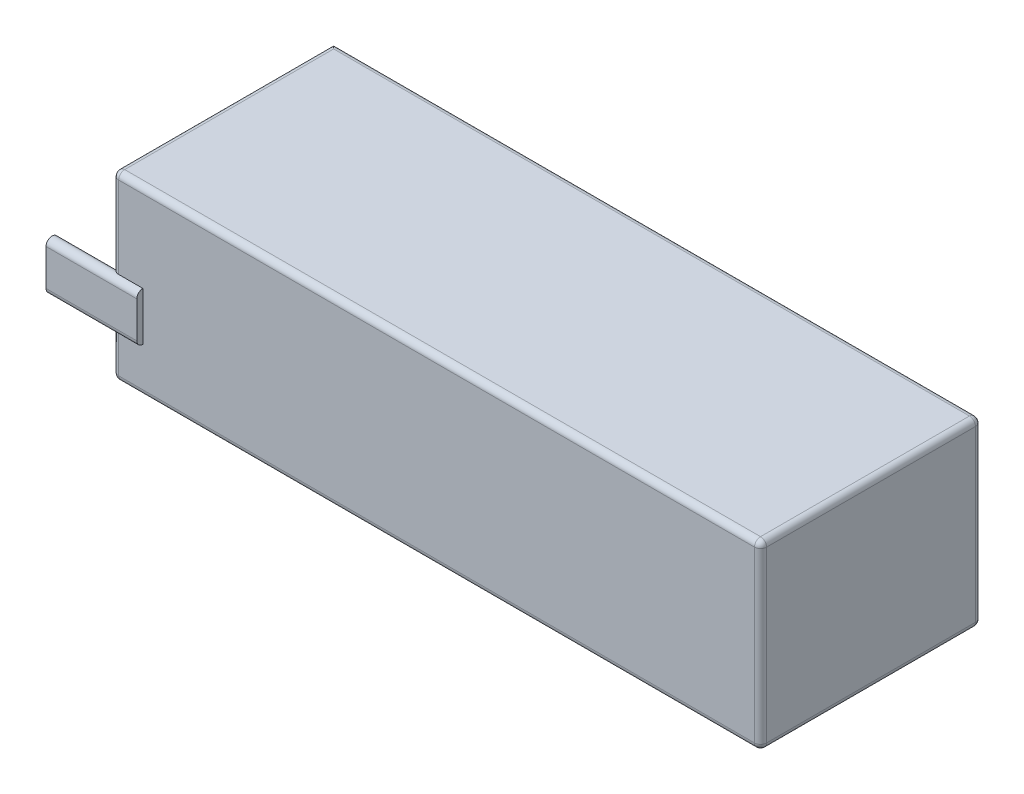
ISO-10303-21;
HEADER;
FILE_DESCRIPTION(('STEP AP214'),'2;1');
FILE_NAME('part.step','',(''),(''),'','','');
FILE_SCHEMA(('AUTOMOTIVE_DESIGN { 1 0 10303 214 1 1 1 1 }'));
ENDSEC;
DATA;
#1=APPLICATION_CONTEXT('core data for automotive mechanical design processes');
#2=APPLICATION_PROTOCOL_DEFINITION('international standard','automotive_design',2000,#1);
#3=PRODUCT_CONTEXT('',#1,'mechanical');
#4=PRODUCT('Part','Part','',(#3));
#5=PRODUCT_RELATED_PRODUCT_CATEGORY('part','',(#4));
#6=PRODUCT_DEFINITION_FORMATION('','',#4);
#7=PRODUCT_DEFINITION_CONTEXT('part definition',#1,'design');
#8=PRODUCT_DEFINITION('design','',#6,#7);
#9=PRODUCT_DEFINITION_SHAPE('','',#8);
#10=(LENGTH_UNIT() NAMED_UNIT(*) SI_UNIT(.MILLI.,.METRE.));
#11=(NAMED_UNIT(*) PLANE_ANGLE_UNIT() SI_UNIT($,.RADIAN.));
#12=(NAMED_UNIT(*) SI_UNIT($,.STERADIAN.) SOLID_ANGLE_UNIT());
#13=UNCERTAINTY_MEASURE_WITH_UNIT(LENGTH_MEASURE(1.E-05),#10,'distance_accuracy_value','');
#14=(GEOMETRIC_REPRESENTATION_CONTEXT(3) GLOBAL_UNCERTAINTY_ASSIGNED_CONTEXT((#13)) GLOBAL_UNIT_ASSIGNED_CONTEXT((#10,
#11,#12)) REPRESENTATION_CONTEXT('',''));
#15=CARTESIAN_POINT('',(0.,0.,0.));
#16=DIRECTION('',(0.,0.,1.));
#17=DIRECTION('',(1.,0.,0.));
#18=AXIS2_PLACEMENT_3D('',#15,#16,#17);
#19=CARTESIAN_POINT('',(-53.5,30.,-18.25));
#20=DIRECTION('',(0.,0.,1.));
#21=DIRECTION('',(1.,0.,0.));
#22=AXIS2_PLACEMENT_3D('',#19,#20,#21);
#23=PLANE('',#22);
#24=DIRECTION('',(0.,-1.,0.));
#25=VECTOR('',#24,1.);
#26=CARTESIAN_POINT('',(52.5,30.,-18.25));
#27=LINE('',#26,#25);
#28=CARTESIAN_POINT('',(52.5,29.,-18.25));
#29=VERTEX_POINT('',#28);
#30=CARTESIAN_POINT('',(52.5,1.,-18.25));
#31=VERTEX_POINT('',#30);
#32=EDGE_CURVE('E294',#29,#31,#27,.T.);
#33=ORIENTED_EDGE('',*,*,#32,.T.);
#34=DIRECTION('',(-1.,0.,0.));
#35=VECTOR('',#34,1.);
#36=CARTESIAN_POINT('',(-53.5,1.,-18.25));
#37=LINE('',#36,#35);
#38=CARTESIAN_POINT('',(-53.5,1.,-18.25));
#39=VERTEX_POINT('',#38);
#40=EDGE_CURVE('E298',#31,#39,#37,.T.);
#41=ORIENTED_EDGE('',*,*,#40,.T.);
#42=DIRECTION('',(0.,-1.,0.));
#43=VECTOR('',#42,1.);
#44=CARTESIAN_POINT('',(-53.5,30.,-18.25));
#45=LINE('',#44,#43);
#46=CARTESIAN_POINT('',(-53.5,9.5,-18.25));
#47=VERTEX_POINT('',#46);
#48=EDGE_CURVE('E252',#47,#39,#45,.T.);
#49=ORIENTED_EDGE('',*,*,#48,.F.);
#50=DIRECTION('',(-1.,0.,0.));
#51=VECTOR('',#50,1.);
#52=CARTESIAN_POINT('',(-48.5,9.5,-18.25));
#53=LINE('',#52,#51);
#54=CARTESIAN_POINT('',(-48.5,9.5,-18.25));
#55=VERTEX_POINT('',#54);
#56=EDGE_CURVE('E259',#55,#47,#53,.T.);
#57=ORIENTED_EDGE('',*,*,#56,.F.);
#58=DIRECTION('',(0.,1.,0.));
#59=VECTOR('',#58,1.);
#60=CARTESIAN_POINT('',(-48.5,9.5,-18.25));
#61=LINE('',#60,#59);
#62=CARTESIAN_POINT('',(-48.5,13.5,-18.25));
#63=VERTEX_POINT('',#62);
#64=EDGE_CURVE('E241',#55,#63,#61,.T.);
#65=ORIENTED_EDGE('',*,*,#64,.T.);
#66=DIRECTION('',(-1.,0.,0.));
#67=VECTOR('',#66,1.);
#68=CARTESIAN_POINT('',(-48.5,13.5,-18.25));
#69=LINE('',#68,#67);
#70=CARTESIAN_POINT('',(-53.5,13.5,-18.25));
#71=VERTEX_POINT('',#70);
#72=EDGE_CURVE('E255',#63,#71,#69,.T.);
#73=ORIENTED_EDGE('',*,*,#72,.T.);
#74=CARTESIAN_POINT('',(-53.5,29.,-18.25));
#75=VERTEX_POINT('',#74);
#76=EDGE_CURVE('E262',#75,#71,#45,.T.);
#77=ORIENTED_EDGE('',*,*,#76,.F.);
#78=DIRECTION('',(-1.,0.,0.));
#79=VECTOR('',#78,1.);
#80=CARTESIAN_POINT('',(53.5,29.,-18.25));
#81=LINE('',#80,#79);
#82=EDGE_CURVE('E296',#75,#29,#81,.F.);
#83=ORIENTED_EDGE('',*,*,#82,.T.);
#84=EDGE_LOOP('',(#33,#41,#49,#57,#65,#73,#77,#83));
#85=FACE_BOUND('',#84,.T.);
#86=ADVANCED_FACE('F37',(#85),#23,.F.);
#87=CARTESIAN_POINT('',(-53.5,30.,-18.25));
#88=DIRECTION('',(1.,0.,0.));
#89=DIRECTION('',(0.,0.,-1.));
#90=AXIS2_PLACEMENT_3D('',#87,#88,#89);
#91=PLANE('',#90);
#92=ORIENTED_EDGE('',*,*,#48,.T.);
#93=DIRECTION('',(0.,0.,1.));
#94=VECTOR('',#93,1.);
#95=CARTESIAN_POINT('',(-53.5,1.,-18.25));
#96=LINE('',#95,#94);
#97=CARTESIAN_POINT('',(-53.5,1.,17.25));
#98=VERTEX_POINT('',#97);
#99=EDGE_CURVE('E306',#39,#98,#96,.T.);
#100=ORIENTED_EDGE('',*,*,#99,.T.);
#101=DIRECTION('',(0.,-1.,0.));
#102=VECTOR('',#101,1.);
#103=CARTESIAN_POINT('',(-53.5,30.,17.25));
#104=LINE('',#103,#102);
#105=CARTESIAN_POINT('',(-53.5,8.5,17.25));
#106=VERTEX_POINT('',#105);
#107=EDGE_CURVE('E304',#98,#106,#104,.F.);
#108=ORIENTED_EDGE('',*,*,#107,.T.);
#109=DIRECTION('',(0.,1.,0.));
#110=VECTOR('',#109,1.);
#111=CARTESIAN_POINT('',(-53.5,30.,17.25));
#112=LINE('',#111,#110);
#113=CARTESIAN_POINT('',(-53.5,14.5,17.25));
#114=VERTEX_POINT('',#113);
#115=EDGE_CURVE('E271',#106,#114,#112,.T.);
#116=ORIENTED_EDGE('',*,*,#115,.T.);
#117=DIRECTION('',(0.,-1.,0.));
#118=VECTOR('',#117,1.);
#119=CARTESIAN_POINT('',(-53.5,30.,17.25));
#120=LINE('',#119,#118);
#121=CARTESIAN_POINT('',(-53.5,29.,17.25));
#122=VERTEX_POINT('',#121);
#123=EDGE_CURVE('E300',#114,#122,#120,.F.);
#124=ORIENTED_EDGE('',*,*,#123,.T.);
#125=DIRECTION('',(0.,0.,1.));
#126=VECTOR('',#125,1.);
#127=CARTESIAN_POINT('',(-53.5,29.,-18.25));
#128=LINE('',#127,#126);
#129=EDGE_CURVE('E302',#122,#75,#128,.F.);
#130=ORIENTED_EDGE('',*,*,#129,.T.);
#131=ORIENTED_EDGE('',*,*,#76,.T.);
#132=EDGE_CURVE('E264',#71,#47,#45,.T.);
#133=ORIENTED_EDGE('',*,*,#132,.T.);
#134=EDGE_LOOP('',(#92,#100,#108,#116,#124,#130,#131,#133));
#135=FACE_BOUND('',#134,.T.);
#136=ADVANCED_FACE('F393',(#135),#91,.F.);
#137=CARTESIAN_POINT('',(-53.5,30.,18.25));
#138=DIRECTION('',(0.,0.,-1.));
#139=DIRECTION('',(-1.,0.,0.));
#140=AXIS2_PLACEMENT_3D('',#137,#138,#139);
#141=PLANE('',#140);
#142=DIRECTION('',(-1.,0.,0.));
#143=VECTOR('',#142,1.);
#144=CARTESIAN_POINT('',(-48.5,7.5,18.25));
#145=LINE('',#144,#143);
#146=CARTESIAN_POINT('',(-48.5,7.5,18.25));
#147=VERTEX_POINT('',#146);
#148=CARTESIAN_POINT('',(-52.5,7.5,18.25));
#149=VERTEX_POINT('',#148);
#150=EDGE_CURVE('E268',#147,#149,#145,.T.);
#151=ORIENTED_EDGE('',*,*,#150,.T.);
#152=DIRECTION('',(0.,-1.,0.));
#153=VECTOR('',#152,1.);
#154=CARTESIAN_POINT('',(-52.5,30.,18.25));
#155=LINE('',#154,#153);
#156=CARTESIAN_POINT('',(-52.5,1.,18.25));
#157=VERTEX_POINT('',#156);
#158=EDGE_CURVE('E283',#149,#157,#155,.T.);
#159=ORIENTED_EDGE('',*,*,#158,.T.);
#160=DIRECTION('',(1.,0.,0.));
#161=VECTOR('',#160,1.);
#162=CARTESIAN_POINT('',(-53.5,1.,18.25));
#163=LINE('',#162,#161);
#164=CARTESIAN_POINT('',(52.5,1.,18.25));
#165=VERTEX_POINT('',#164);
#166=EDGE_CURVE('E280',#157,#165,#163,.T.);
#167=ORIENTED_EDGE('',*,*,#166,.T.);
#168=DIRECTION('',(0.,-1.,0.));
#169=VECTOR('',#168,1.);
#170=CARTESIAN_POINT('',(52.5,30.,18.25));
#171=LINE('',#170,#169);
#172=CARTESIAN_POINT('',(52.5,29.,18.25));
#173=VERTEX_POINT('',#172);
#174=EDGE_CURVE('E278',#165,#173,#171,.F.);
#175=ORIENTED_EDGE('',*,*,#174,.T.);
#176=DIRECTION('',(1.,0.,0.));
#177=VECTOR('',#176,1.);
#178=CARTESIAN_POINT('',(-53.5,29.,18.25));
#179=LINE('',#178,#177);
#180=CARTESIAN_POINT('',(-52.5,29.,18.25));
#181=VERTEX_POINT('',#180);
#182=EDGE_CURVE('E276',#173,#181,#179,.F.);
#183=ORIENTED_EDGE('',*,*,#182,.T.);
#184=DIRECTION('',(0.,-1.,0.));
#185=VECTOR('',#184,1.);
#186=CARTESIAN_POINT('',(-52.5,30.,18.25));
#187=LINE('',#186,#185);
#188=CARTESIAN_POINT('',(-52.5,15.5,18.25));
#189=VERTEX_POINT('',#188);
#190=EDGE_CURVE('E274',#181,#189,#187,.T.);
#191=ORIENTED_EDGE('',*,*,#190,.T.);
#192=DIRECTION('',(-1.,0.,0.));
#193=VECTOR('',#192,1.);
#194=CARTESIAN_POINT('',(-48.5,15.5,18.25));
#195=LINE('',#194,#193);
#196=CARTESIAN_POINT('',(-48.5,15.5,18.25));
#197=VERTEX_POINT('',#196);
#198=EDGE_CURVE('E266',#189,#197,#195,.F.);
#199=ORIENTED_EDGE('',*,*,#198,.T.);
#200=DIRECTION('',(0.,1.,0.));
#201=VECTOR('',#200,1.);
#202=CARTESIAN_POINT('',(-48.5,30.,18.25));
#203=LINE('',#202,#201);
#204=EDGE_CURVE('E208',#147,#197,#203,.T.);
#205=ORIENTED_EDGE('',*,*,#204,.F.);
#206=EDGE_LOOP('',(#151,#159,#167,#175,#183,#191,#199,#205));
#207=FACE_BOUND('',#206,.T.);
#208=ADVANCED_FACE('F397',(#207),#141,.F.);
#209=CARTESIAN_POINT('',(53.5,30.,-18.25));
#210=DIRECTION('',(-1.,0.,0.));
#211=DIRECTION('',(0.,0.,1.));
#212=AXIS2_PLACEMENT_3D('',#209,#210,#211);
#213=PLANE('',#212);
#214=DIRECTION('',(0.,0.,-1.));
#215=VECTOR('',#214,1.);
#216=CARTESIAN_POINT('',(53.5,29.,18.25));
#217=LINE('',#216,#215);
#218=CARTESIAN_POINT('',(53.5,29.,-17.25));
#219=VERTEX_POINT('',#218);
#220=CARTESIAN_POINT('',(53.5,29.,17.25));
#221=VERTEX_POINT('',#220);
#222=EDGE_CURVE('E55',#219,#221,#217,.F.);
#223=ORIENTED_EDGE('',*,*,#222,.T.);
#224=DIRECTION('',(0.,-1.,0.));
#225=VECTOR('',#224,1.);
#226=CARTESIAN_POINT('',(53.5,30.,17.25));
#227=LINE('',#226,#225);
#228=CARTESIAN_POINT('',(53.5,1.,17.25));
#229=VERTEX_POINT('',#228);
#230=EDGE_CURVE('E321',#221,#229,#227,.T.);
#231=ORIENTED_EDGE('',*,*,#230,.T.);
#232=DIRECTION('',(0.,0.,-1.));
#233=VECTOR('',#232,1.);
#234=CARTESIAN_POINT('',(53.5,1.,-18.25));
#235=LINE('',#234,#233);
#236=CARTESIAN_POINT('',(53.5,1.,-17.25));
#237=VERTEX_POINT('',#236);
#238=EDGE_CURVE('E317',#229,#237,#235,.T.);
#239=ORIENTED_EDGE('',*,*,#238,.T.);
#240=DIRECTION('',(0.,-1.,0.));
#241=VECTOR('',#240,1.);
#242=CARTESIAN_POINT('',(53.5,30.,-17.25));
#243=LINE('',#242,#241);
#244=EDGE_CURVE('E60',#237,#219,#243,.F.);
#245=ORIENTED_EDGE('',*,*,#244,.T.);
#246=EDGE_LOOP('',(#223,#231,#239,#245));
#247=FACE_BOUND('',#246,.T.);
#248=ADVANCED_FACE('F386',(#247),#213,.F.);
#249=CARTESIAN_POINT('',(0.,30.,0.));
#250=DIRECTION('',(0.,1.,0.));
#251=DIRECTION('',(0.,0.,1.));
#252=AXIS2_PLACEMENT_3D('',#249,#250,#251);
#253=PLANE('',#252);
#254=DIRECTION('',(-1.,0.,0.));
#255=VECTOR('',#254,1.);
#256=CARTESIAN_POINT('',(-53.5,30.,-17.25));
#257=LINE('',#256,#255);
#258=CARTESIAN_POINT('',(52.5,30.,-17.25));
#259=VERTEX_POINT('',#258);
#260=CARTESIAN_POINT('',(-52.5,30.,-17.25));
#261=VERTEX_POINT('',#260);
#262=EDGE_CURVE('E312',#259,#261,#257,.T.);
#263=ORIENTED_EDGE('',*,*,#262,.T.);
#264=DIRECTION('',(0.,0.,1.));
#265=VECTOR('',#264,1.);
#266=CARTESIAN_POINT('',(-52.5,30.,18.25));
#267=LINE('',#266,#265);
#268=CARTESIAN_POINT('',(-52.5,30.,17.25));
#269=VERTEX_POINT('',#268);
#270=EDGE_CURVE('E315',#261,#269,#267,.T.);
#271=ORIENTED_EDGE('',*,*,#270,.T.);
#272=DIRECTION('',(1.,0.,0.));
#273=VECTOR('',#272,1.);
#274=CARTESIAN_POINT('',(53.5,30.,17.25));
#275=LINE('',#274,#273);
#276=CARTESIAN_POINT('',(52.5,30.,17.25));
#277=VERTEX_POINT('',#276);
#278=EDGE_CURVE('E310',#269,#277,#275,.T.);
#279=ORIENTED_EDGE('',*,*,#278,.T.);
#280=DIRECTION('',(0.,0.,-1.));
#281=VECTOR('',#280,1.);
#282=CARTESIAN_POINT('',(52.5,30.,-18.25));
#283=LINE('',#282,#281);
#284=EDGE_CURVE('E308',#277,#259,#283,.T.);
#285=ORIENTED_EDGE('',*,*,#284,.T.);
#286=EDGE_LOOP('',(#263,#271,#279,#285));
#287=FACE_BOUND('',#286,.T.);
#288=ADVANCED_FACE('F383',(#287),#253,.T.);
#289=CARTESIAN_POINT('',(0.,0.,0.));
#290=DIRECTION('',(0.,1.,0.));
#291=DIRECTION('',(0.,0.,1.));
#292=AXIS2_PLACEMENT_3D('',#289,#290,#291);
#293=PLANE('',#292);
#294=DIRECTION('',(1.,0.,0.));
#295=VECTOR('',#294,1.);
#296=CARTESIAN_POINT('',(0.,0.,17.25));
#297=LINE('',#296,#295);
#298=CARTESIAN_POINT('',(52.5,0.,17.25));
#299=VERTEX_POINT('',#298);
#300=CARTESIAN_POINT('',(-52.5,0.,17.25));
#301=VERTEX_POINT('',#300);
#302=EDGE_CURVE('E289',#299,#301,#297,.F.);
#303=ORIENTED_EDGE('',*,*,#302,.T.);
#304=DIRECTION('',(0.,0.,1.));
#305=VECTOR('',#304,1.);
#306=CARTESIAN_POINT('',(-52.5,0.,0.));
#307=LINE('',#306,#305);
#308=CARTESIAN_POINT('',(-52.5,0.,-17.25));
#309=VERTEX_POINT('',#308);
#310=EDGE_CURVE('E292',#301,#309,#307,.F.);
#311=ORIENTED_EDGE('',*,*,#310,.T.);
#312=DIRECTION('',(-1.,0.,0.));
#313=VECTOR('',#312,1.);
#314=CARTESIAN_POINT('',(0.,0.,-17.25));
#315=LINE('',#314,#313);
#316=CARTESIAN_POINT('',(52.5,0.,-17.25));
#317=VERTEX_POINT('',#316);
#318=EDGE_CURVE('E287',#309,#317,#315,.F.);
#319=ORIENTED_EDGE('',*,*,#318,.T.);
#320=DIRECTION('',(0.,0.,-1.));
#321=VECTOR('',#320,1.);
#322=CARTESIAN_POINT('',(52.5,0.,0.));
#323=LINE('',#322,#321);
#324=EDGE_CURVE('E285',#317,#299,#323,.F.);
#325=ORIENTED_EDGE('',*,*,#324,.T.);
#326=EDGE_LOOP('',(#303,#311,#319,#325));
#327=FACE_BOUND('',#326,.T.);
#328=ADVANCED_FACE('F378',(#327),#293,.F.);
#329=CARTESIAN_POINT('',(-48.5,9.5,-18.25));
#330=DIRECTION('',(0.,0.,1.));
#331=DIRECTION('',(1.,0.,0.));
#332=AXIS2_PLACEMENT_3D('',#329,#330,#331);
#333=PLANE('',#332);
#334=ORIENTED_EDGE('',*,*,#132,.F.);
#335=CARTESIAN_POINT('',(-63.5,13.5,-18.25));
#336=VERTEX_POINT('',#335);
#337=EDGE_CURVE('E258',#71,#336,#69,.T.);
#338=ORIENTED_EDGE('',*,*,#337,.T.);
#339=DIRECTION('',(0.,1.,0.));
#340=VECTOR('',#339,1.);
#341=CARTESIAN_POINT('',(-63.5,9.5,-18.25));
#342=LINE('',#341,#340);
#343=CARTESIAN_POINT('',(-63.5,9.5,-18.25));
#344=VERTEX_POINT('',#343);
#345=EDGE_CURVE('E229',#344,#336,#342,.T.);
#346=ORIENTED_EDGE('',*,*,#345,.F.);
#347=EDGE_CURVE('E249',#47,#344,#53,.T.);
#348=ORIENTED_EDGE('',*,*,#347,.F.);
#349=EDGE_LOOP('',(#334,#338,#346,#348));
#350=FACE_BOUND('',#349,.T.);
#351=ADVANCED_FACE('F375',(#350),#333,.T.);
#352=CARTESIAN_POINT('',(-48.5,9.5,-19.75));
#353=DIRECTION('',(-1.,0.,0.));
#354=DIRECTION('',(0.,0.,1.));
#355=AXIS2_PLACEMENT_3D('',#352,#353,#354);
#356=CYLINDRICAL_SURFACE('',#355,1.5);
#357=ORIENTED_EDGE('',*,*,#56,.T.);
#358=ORIENTED_EDGE('',*,*,#347,.T.);
#359=CARTESIAN_POINT('',(-63.5,9.5,-19.75));
#360=DIRECTION('',(-1.,0.,0.));
#361=DIRECTION('',(0.,0.,1.));
#362=AXIS2_PLACEMENT_3D('',#359,#360,#361);
#363=CIRCLE('',#362,1.5);
#364=CARTESIAN_POINT('',(-63.5,9.5,-21.25));
#365=VERTEX_POINT('',#364);
#366=EDGE_CURVE('E226',#365,#344,#363,.T.);
#367=ORIENTED_EDGE('',*,*,#366,.F.);
#368=DIRECTION('',(-1.,0.,0.));
#369=VECTOR('',#368,1.);
#370=CARTESIAN_POINT('',(-48.5,9.5,-21.25));
#371=LINE('',#370,#369);
#372=CARTESIAN_POINT('',(-48.5,9.5,-21.25));
#373=VERTEX_POINT('',#372);
#374=EDGE_CURVE('E250',#373,#365,#371,.T.);
#375=ORIENTED_EDGE('',*,*,#374,.F.);
#376=CARTESIAN_POINT('',(-48.5,9.5,-19.75));
#377=DIRECTION('',(-1.,0.,0.));
#378=DIRECTION('',(0.,0.,1.));
#379=AXIS2_PLACEMENT_3D('',#376,#377,#378);
#380=CIRCLE('',#379,1.5);
#381=EDGE_CURVE('E238',#373,#55,#380,.T.);
#382=ORIENTED_EDGE('',*,*,#381,.T.);
#383=EDGE_LOOP('',(#357,#358,#367,#375,#382));
#384=FACE_BOUND('',#383,.T.);
#385=ADVANCED_FACE('F370',(#384),#356,.T.);
#386=CARTESIAN_POINT('',(-48.5,9.5,-21.25));
#387=DIRECTION('',(0.,0.,-1.));
#388=DIRECTION('',(-1.,0.,0.));
#389=AXIS2_PLACEMENT_3D('',#386,#387,#388);
#390=PLANE('',#389);
#391=ORIENTED_EDGE('',*,*,#374,.T.);
#392=DIRECTION('',(0.,-1.,0.));
#393=VECTOR('',#392,1.);
#394=CARTESIAN_POINT('',(-63.5,9.5,-21.25));
#395=LINE('',#394,#393);
#396=CARTESIAN_POINT('',(-63.5,13.5,-21.25));
#397=VERTEX_POINT('',#396);
#398=EDGE_CURVE('E235',#397,#365,#395,.T.);
#399=ORIENTED_EDGE('',*,*,#398,.F.);
#400=DIRECTION('',(-1.,0.,0.));
#401=VECTOR('',#400,1.);
#402=CARTESIAN_POINT('',(-48.5,13.5,-21.25));
#403=LINE('',#402,#401);
#404=CARTESIAN_POINT('',(-48.5,13.5,-21.25));
#405=VERTEX_POINT('',#404);
#406=EDGE_CURVE('E253',#405,#397,#403,.T.);
#407=ORIENTED_EDGE('',*,*,#406,.F.);
#408=DIRECTION('',(0.,-1.,0.));
#409=VECTOR('',#408,1.);
#410=CARTESIAN_POINT('',(-48.5,9.5,-21.25));
#411=LINE('',#410,#409);
#412=EDGE_CURVE('E246',#405,#373,#411,.T.);
#413=ORIENTED_EDGE('',*,*,#412,.T.);
#414=EDGE_LOOP('',(#391,#399,#407,#413));
#415=FACE_BOUND('',#414,.T.);
#416=ADVANCED_FACE('F367',(#415),#390,.T.);
#417=CARTESIAN_POINT('',(-48.5,13.5,-19.75));
#418=DIRECTION('',(-1.,0.,0.));
#419=DIRECTION('',(0.,0.,1.));
#420=AXIS2_PLACEMENT_3D('',#417,#418,#419);
#421=CYLINDRICAL_SURFACE('',#420,1.5);
#422=ORIENTED_EDGE('',*,*,#406,.T.);
#423=CARTESIAN_POINT('',(-63.5,13.5,-19.75));
#424=DIRECTION('',(-1.,0.,0.));
#425=DIRECTION('',(0.,0.,1.));
#426=AXIS2_PLACEMENT_3D('',#423,#424,#425);
#427=CIRCLE('',#426,1.5);
#428=EDGE_CURVE('E232',#336,#397,#427,.T.);
#429=ORIENTED_EDGE('',*,*,#428,.F.);
#430=ORIENTED_EDGE('',*,*,#337,.F.);
#431=ORIENTED_EDGE('',*,*,#72,.F.);
#432=CARTESIAN_POINT('',(-48.5,13.5,-19.75));
#433=DIRECTION('',(-1.,0.,0.));
#434=DIRECTION('',(0.,0.,1.));
#435=AXIS2_PLACEMENT_3D('',#432,#433,#434);
#436=CIRCLE('',#435,1.5);
#437=EDGE_CURVE('E243',#63,#405,#436,.T.);
#438=ORIENTED_EDGE('',*,*,#437,.T.);
#439=EDGE_LOOP('',(#422,#429,#430,#431,#438));
#440=FACE_BOUND('',#439,.T.);
#441=ADVANCED_FACE('F365',(#440),#421,.T.);
#442=CARTESIAN_POINT('',(-48.5,9.5,-19.75));
#443=DIRECTION('',(-1.,0.,0.));
#444=DIRECTION('',(0.,0.,1.));
#445=AXIS2_PLACEMENT_3D('',#442,#443,#444);
#446=PLANE('',#445);
#447=ORIENTED_EDGE('',*,*,#381,.F.);
#448=ORIENTED_EDGE('',*,*,#412,.F.);
#449=ORIENTED_EDGE('',*,*,#437,.F.);
#450=ORIENTED_EDGE('',*,*,#64,.F.);
#451=EDGE_LOOP('',(#447,#448,#449,#450));
#452=FACE_BOUND('',#451,.T.);
#453=ADVANCED_FACE('F361',(#452),#446,.F.);
#454=CARTESIAN_POINT('',(-63.5,9.5,-19.75));
#455=DIRECTION('',(-1.,0.,0.));
#456=DIRECTION('',(0.,0.,1.));
#457=AXIS2_PLACEMENT_3D('',#454,#455,#456);
#458=PLANE('',#457);
#459=ORIENTED_EDGE('',*,*,#366,.T.);
#460=ORIENTED_EDGE('',*,*,#345,.T.);
#461=ORIENTED_EDGE('',*,*,#428,.T.);
#462=ORIENTED_EDGE('',*,*,#398,.T.);
#463=EDGE_LOOP('',(#459,#460,#461,#462));
#464=FACE_BOUND('',#463,.T.);
#465=ADVANCED_FACE('F352',(#464),#458,.T.);
#466=CARTESIAN_POINT('',(-48.5,8.5,17.25));
#467=DIRECTION('',(0.,0.,-1.));
#468=DIRECTION('',(-1.,0.,0.));
#469=AXIS2_PLACEMENT_3D('',#466,#467,#468);
#470=PLANE('',#469);
#471=ORIENTED_EDGE('',*,*,#115,.F.);
#472=DIRECTION('',(-1.,0.,0.));
#473=VECTOR('',#472,1.);
#474=CARTESIAN_POINT('',(-48.5,8.5,17.25));
#475=LINE('',#474,#473);
#476=CARTESIAN_POINT('',(-63.5,8.5,17.25));
#477=VERTEX_POINT('',#476);
#478=EDGE_CURVE('E474',#106,#477,#475,.T.);
#479=ORIENTED_EDGE('',*,*,#478,.T.);
#480=DIRECTION('',(0.,-1.,0.));
#481=VECTOR('',#480,1.);
#482=CARTESIAN_POINT('',(-63.5,8.5,17.25));
#483=LINE('',#482,#481);
#484=CARTESIAN_POINT('',(-63.5,14.5,17.25));
#485=VERTEX_POINT('',#484);
#486=EDGE_CURVE('E214',#485,#477,#483,.T.);
#487=ORIENTED_EDGE('',*,*,#486,.F.);
#488=DIRECTION('',(-1.,0.,0.));
#489=VECTOR('',#488,1.);
#490=CARTESIAN_POINT('',(-48.5,14.5,17.25));
#491=LINE('',#490,#489);
#492=EDGE_CURVE('E200',#114,#485,#491,.T.);
#493=ORIENTED_EDGE('',*,*,#492,.F.);
#494=EDGE_LOOP('',(#471,#479,#487,#493));
#495=FACE_BOUND('',#494,.T.);
#496=ADVANCED_FACE('F343',(#495),#470,.T.);
#497=CARTESIAN_POINT('',(-48.5,8.5,18.25));
#498=DIRECTION('',(-1.,0.,0.));
#499=DIRECTION('',(0.,0.,1.));
#500=AXIS2_PLACEMENT_3D('',#497,#498,#499);
#501=CYLINDRICAL_SURFACE('',#500,1.);
#502=ORIENTED_EDGE('',*,*,#478,.F.);
#503=CARTESIAN_POINT('',(-53.5,8.5,17.25));
#504=CARTESIAN_POINT('',(-53.4999915273139,8.4721618072782,17.2499974449256));
#505=CARTESIAN_POINT('',(-53.49999978463,8.44432491694179,17.2511624505639));
#506=CARTESIAN_POINT('',(-53.4999880697923,8.38884512847469,17.255807753806));
#507=CARTESIAN_POINT('',(-53.4999680978103,8.36120222916399,17.2592880373139));
#508=CARTESIAN_POINT('',(-53.499838122104,8.30625318801878,17.2685522068392));
#509=CARTESIAN_POINT('',(-53.4997279600974,8.27894772396443,17.2743401335675));
#510=CARTESIAN_POINT('',(-53.4992948443434,8.22492462235579,17.2881724855126));
#511=CARTESIAN_POINT('',(-53.4989718933492,8.19820697720056,17.2962168815332));
#512=CARTESIAN_POINT('',(-53.4974536894179,8.1191613993586,17.3236805454581));
#513=CARTESIAN_POINT('',(-53.4957090051225,8.06795071523256,17.3464286131267));
#514=CARTESIAN_POINT('',(-53.4890478897459,7.97023848573536,17.4000264090444));
#515=CARTESIAN_POINT('',(-53.4841343606377,7.92373267675533,17.4308687094247));
#516=CARTESIAN_POINT('',(-53.4693336992212,7.838654900196,17.4980423414366));
#517=CARTESIAN_POINT('',(-53.4596481926507,7.79984410209823,17.5341124218488));
#518=CARTESIAN_POINT('',(-53.4335989981964,7.72940315441028,17.6105697570729));
#519=CARTESIAN_POINT('',(-53.417245590848,7.69776206691236,17.6509502956064));
#520=CARTESIAN_POINT('',(-53.3794734224097,7.64622485409753,17.7275936517136));
#521=CARTESIAN_POINT('',(-53.3590473185644,7.625316220434,17.7636686646856));
#522=CARTESIAN_POINT('',(-53.3122441705969,7.5893643518775,17.8348688895248));
#523=CARTESIAN_POINT('',(-53.2858668676329,7.57432137218339,17.869994060005));
#524=CARTESIAN_POINT('',(-53.2293358302535,7.55015559677196,17.9354434191223));
#525=CARTESIAN_POINT('',(-53.1994890903201,7.5407405067344,17.9659278211332));
#526=CARTESIAN_POINT('',(-53.1356188135375,7.52560891786249,18.023195036806));
#527=CARTESIAN_POINT('',(-53.1015942735558,7.51989330938569,18.0499769581697));
#528=CARTESIAN_POINT('',(-53.0265924301931,7.51071496387938,18.1014506190333));
#529=CARTESIAN_POINT('',(-52.9852603057874,7.50753084904885,18.1256738815927));
#530=CARTESIAN_POINT('',(-52.8994625197932,7.50314024893534,18.1679998708196));
#531=CARTESIAN_POINT('',(-52.854994278958,7.50193541173267,18.1860974869159));
#532=CARTESIAN_POINT('',(-52.7595676332025,7.50040577184265,18.2171453798211));
#533=CARTESIAN_POINT('',(-52.7083933218189,7.50017506579652,18.2294462717386));
#534=CARTESIAN_POINT('',(-52.6307230912508,7.50002667819821,18.2417668949806));
#535=CARTESIAN_POINT('',(-52.6046769026901,7.50001017537287,18.2448519867077));
#536=CARTESIAN_POINT('',(-52.5524243977987,7.49999937163049,18.2489682613339));
#537=CARTESIAN_POINT('',(-52.5262180920361,7.50000506926366,18.2499995783472));
#538=CARTESIAN_POINT('',(-52.5,7.5,18.25));
#539=B_SPLINE_CURVE_WITH_KNOTS('',3,(#503,#504,#505,#506,#507,#508,#509,#510,#511,#512,#513,
#514,#515,#516,#517,#518,#519,#520,#521,#522,#523,#524,#525,#526,#527,#528,#529,#530,#531,#532,
#533,#534,#535,#536,#537,#538),.UNSPECIFIED.,.F.,.F.,(4,2,2,2,2,2,2,2,2,2,2,2,2,2,2,2,2,4),(0.,
0.083487834728174,0.166975161167903,0.250609321497258,0.334242399739242,0.501538275082881,
0.668681160903593,0.829299803909306,0.989671736729568,1.12821123604276,1.26675676216527,
1.39728229603103,1.52783923192528,1.67130468492801,1.81488953652532,1.97206569111011,
2.05068136863726,2.12929191228915),.UNSPECIFIED.);
#540=EDGE_CURVE('E47',#106,#149,#539,.T.);
#541=ORIENTED_EDGE('',*,*,#540,.T.);
#542=ORIENTED_EDGE('',*,*,#150,.F.);
#543=CARTESIAN_POINT('',(-48.5,8.5,18.25));
#544=DIRECTION('',(-1.,0.,0.));
#545=DIRECTION('',(0.,0.,1.));
#546=AXIS2_PLACEMENT_3D('',#543,#544,#545);
#547=CIRCLE('',#546,1.);
#548=CARTESIAN_POINT('',(-48.5,8.5,19.25));
#549=VERTEX_POINT('',#548);
#550=EDGE_CURVE('E212',#147,#549,#547,.T.);
#551=ORIENTED_EDGE('',*,*,#550,.T.);
#552=DIRECTION('',(-1.,0.,0.));
#553=VECTOR('',#552,1.);
#554=CARTESIAN_POINT('',(-48.5,8.5,19.25));
#555=LINE('',#554,#553);
#556=CARTESIAN_POINT('',(-63.5,8.5,19.25));
#557=VERTEX_POINT('',#556);
#558=EDGE_CURVE('E199',#549,#557,#555,.T.);
#559=ORIENTED_EDGE('',*,*,#558,.T.);
#560=CARTESIAN_POINT('',(-63.5,8.5,18.25));
#561=DIRECTION('',(-1.,0.,0.));
#562=DIRECTION('',(0.,0.,1.));
#563=AXIS2_PLACEMENT_3D('',#560,#561,#562);
#564=CIRCLE('',#563,1.);
#565=EDGE_CURVE('E223',#477,#557,#564,.T.);
#566=ORIENTED_EDGE('',*,*,#565,.F.);
#567=EDGE_LOOP('',(#502,#541,#542,#551,#559,#566));
#568=FACE_BOUND('',#567,.T.);
#569=ADVANCED_FACE('F339',(#568),#501,.T.);
#570=CARTESIAN_POINT('',(-48.5,14.5,18.25));
#571=DIRECTION('',(-1.,0.,0.));
#572=DIRECTION('',(0.,0.,1.));
#573=AXIS2_PLACEMENT_3D('',#570,#571,#572);
#574=CYLINDRICAL_SURFACE('',#573,1.);
#575=ORIENTED_EDGE('',*,*,#198,.F.);
#576=CARTESIAN_POINT('',(-52.5,15.5,18.25));
#577=CARTESIAN_POINT('',(-52.5278381927218,15.4999915273139,18.2500025550744));
#578=CARTESIAN_POINT('',(-52.5556750830582,15.49999978463,18.2488375494361));
#579=CARTESIAN_POINT('',(-52.6111548715253,15.4999880697923,18.2441922461939));
#580=CARTESIAN_POINT('',(-52.638797770836,15.4999680978104,18.240711962686));
#581=CARTESIAN_POINT('',(-52.6937468119812,15.499838122104,18.2314477931608));
#582=CARTESIAN_POINT('',(-52.7210522760356,15.4997279600974,18.2256598664325));
#583=CARTESIAN_POINT('',(-52.7750753776442,15.4992948443434,18.2118275144874));
#584=CARTESIAN_POINT('',(-52.8017930227994,15.4989718933492,18.2037831184667));
#585=CARTESIAN_POINT('',(-52.8808386006414,15.4974536894179,18.1763194545419));
#586=CARTESIAN_POINT('',(-52.9320492847674,15.4957090051225,18.1535713868733));
#587=CARTESIAN_POINT('',(-53.0297615142646,15.4890478897459,18.0999735909556));
#588=CARTESIAN_POINT('',(-53.0762673232447,15.4841343606377,18.0691312905752));
#589=CARTESIAN_POINT('',(-53.161345099804,15.4693336992212,18.0019576585634));
#590=CARTESIAN_POINT('',(-53.2001558979018,15.4596481926507,17.9658875781512));
#591=CARTESIAN_POINT('',(-53.2705968455897,15.4335989981964,17.8894302429271));
#592=CARTESIAN_POINT('',(-53.3022379330876,15.417245590848,17.8490497043936));
#593=CARTESIAN_POINT('',(-53.3537751459025,15.3794734224097,17.7724063482864));
#594=CARTESIAN_POINT('',(-53.374683779566,15.3590473185644,17.7363313353144));
#595=CARTESIAN_POINT('',(-53.4106356481225,15.3122441705969,17.6651311104752));
#596=CARTESIAN_POINT('',(-53.4256786278166,15.2858668676329,17.630005939995));
#597=CARTESIAN_POINT('',(-53.449844403228,15.2293358302535,17.5645565808777));
#598=CARTESIAN_POINT('',(-53.4592594932656,15.1994890903201,17.5340721788668));
#599=CARTESIAN_POINT('',(-53.4743910821375,15.1356188135375,17.476804963194));
#600=CARTESIAN_POINT('',(-53.4801066906143,15.1015942735558,17.4500230418303));
#601=CARTESIAN_POINT('',(-53.4892850361206,15.0265924301931,17.3985493809667));
#602=CARTESIAN_POINT('',(-53.4924691509511,14.9852603057874,17.3743261184073));
#603=CARTESIAN_POINT('',(-53.4968597510647,14.8994625197932,17.3320001291804));
#604=CARTESIAN_POINT('',(-53.4980645882673,14.854994278958,17.3139025130841));
#605=CARTESIAN_POINT('',(-53.4995942281573,14.7595676332025,17.2828546201789));
#606=CARTESIAN_POINT('',(-53.4998249342035,14.7083933218189,17.2705537282614));
#607=CARTESIAN_POINT('',(-53.4999733218018,14.6307230912508,17.2582331050194));
#608=CARTESIAN_POINT('',(-53.4999898246271,14.6046769026901,17.2551480132923));
#609=CARTESIAN_POINT('',(-53.5000006283695,14.5524243977987,17.2510317386661));
#610=CARTESIAN_POINT('',(-53.4999949307363,14.5262180920361,17.2500004216528));
#611=CARTESIAN_POINT('',(-53.5,14.5,17.25));
#612=B_SPLINE_CURVE_WITH_KNOTS('',3,(#576,#577,#578,#579,#580,#581,#582,#583,#584,#585,#586,
#587,#588,#589,#590,#591,#592,#593,#594,#595,#596,#597,#598,#599,#600,#601,#602,#603,#604,#605,
#606,#607,#608,#609,#610,#611),.UNSPECIFIED.,.F.,.F.,(4,2,2,2,2,2,2,2,2,2,2,2,2,2,2,2,2,4),(0.,
0.0834878347281705,0.166975161167899,0.250609321497252,0.334242399739242,0.501538275082882,
0.668681160903596,0.829299803909303,0.989671736729569,1.12821123604275,1.26675676216527,
1.39728229603103,1.52783923192528,1.671304684928,1.81488953652532,1.97206569111011,
2.05068136863727,2.12929191228916),.UNSPECIFIED.);
#613=EDGE_CURVE('E11',#189,#114,#612,.T.);
#614=ORIENTED_EDGE('',*,*,#613,.T.);
#615=ORIENTED_EDGE('',*,*,#492,.T.);
#616=CARTESIAN_POINT('',(-63.5,14.5,18.25));
#617=DIRECTION('',(-1.,0.,0.));
#618=DIRECTION('',(0.,0.,1.));
#619=AXIS2_PLACEMENT_3D('',#616,#617,#618);
#620=CIRCLE('',#619,1.);
#621=CARTESIAN_POINT('',(-63.5,14.5,19.25));
#622=VERTEX_POINT('',#621);
#623=EDGE_CURVE('E194',#622,#485,#620,.T.);
#624=ORIENTED_EDGE('',*,*,#623,.F.);
#625=DIRECTION('',(-1.,0.,0.));
#626=VECTOR('',#625,1.);
#627=CARTESIAN_POINT('',(-48.5,14.5,19.25));
#628=LINE('',#627,#626);
#629=CARTESIAN_POINT('',(-48.5,14.5,19.25));
#630=VERTEX_POINT('',#629);
#631=EDGE_CURVE('E188',#630,#622,#628,.T.);
#632=ORIENTED_EDGE('',*,*,#631,.F.);
#633=CARTESIAN_POINT('',(-48.5,14.5,18.25));
#634=DIRECTION('',(-1.,0.,0.));
#635=DIRECTION('',(0.,0.,1.));
#636=AXIS2_PLACEMENT_3D('',#633,#634,#635);
#637=CIRCLE('',#636,1.);
#638=EDGE_CURVE('E192',#630,#197,#637,.T.);
#639=ORIENTED_EDGE('',*,*,#638,.T.);
#640=EDGE_LOOP('',(#575,#614,#615,#624,#632,#639));
#641=FACE_BOUND('',#640,.T.);
#642=ADVANCED_FACE('F191',(#641),#574,.T.);
#643=CARTESIAN_POINT('',(-48.5,8.5,18.25));
#644=DIRECTION('',(-1.,0.,0.));
#645=DIRECTION('',(0.,0.,1.));
#646=AXIS2_PLACEMENT_3D('',#643,#644,#645);
#647=PLANE('',#646);
#648=ORIENTED_EDGE('',*,*,#550,.F.);
#649=ORIENTED_EDGE('',*,*,#204,.T.);
#650=ORIENTED_EDGE('',*,*,#638,.F.);
#651=DIRECTION('',(0.,1.,0.));
#652=VECTOR('',#651,1.);
#653=CARTESIAN_POINT('',(-48.5,8.5,19.25));
#654=LINE('',#653,#652);
#655=EDGE_CURVE('E207',#549,#630,#654,.T.);
#656=ORIENTED_EDGE('',*,*,#655,.F.);
#657=EDGE_LOOP('',(#648,#649,#650,#656));
#658=FACE_BOUND('',#657,.T.);
#659=ADVANCED_FACE('F206',(#658),#647,.F.);
#660=CARTESIAN_POINT('',(-48.5,8.5,19.25));
#661=DIRECTION('',(0.,0.,1.));
#662=DIRECTION('',(1.,0.,0.));
#663=AXIS2_PLACEMENT_3D('',#660,#661,#662);
#664=PLANE('',#663);
#665=ORIENTED_EDGE('',*,*,#631,.T.);
#666=DIRECTION('',(0.,1.,0.));
#667=VECTOR('',#666,1.);
#668=CARTESIAN_POINT('',(-63.5,8.5,19.25));
#669=LINE('',#668,#667);
#670=EDGE_CURVE('E221',#557,#622,#669,.T.);
#671=ORIENTED_EDGE('',*,*,#670,.F.);
#672=ORIENTED_EDGE('',*,*,#558,.F.);
#673=ORIENTED_EDGE('',*,*,#655,.T.);
#674=EDGE_LOOP('',(#665,#671,#672,#673));
#675=FACE_BOUND('',#674,.T.);
#676=ADVANCED_FACE('F211',(#675),#664,.T.);
#677=CARTESIAN_POINT('',(-63.5,8.5,18.25));
#678=DIRECTION('',(-1.,0.,0.));
#679=DIRECTION('',(0.,0.,1.));
#680=AXIS2_PLACEMENT_3D('',#677,#678,#679);
#681=PLANE('',#680);
#682=ORIENTED_EDGE('',*,*,#565,.T.);
#683=ORIENTED_EDGE('',*,*,#670,.T.);
#684=ORIENTED_EDGE('',*,*,#623,.T.);
#685=ORIENTED_EDGE('',*,*,#486,.T.);
#686=EDGE_LOOP('',(#682,#683,#684,#685));
#687=FACE_BOUND('',#686,.T.);
#688=ADVANCED_FACE('F346',(#687),#681,.T.);
#689=CARTESIAN_POINT('',(-52.5,30.,17.25));
#690=DIRECTION('',(0.,-1.,0.));
#691=DIRECTION('',(0.,0.,-1.));
#692=AXIS2_PLACEMENT_3D('',#689,#690,#691);
#693=CYLINDRICAL_SURFACE('',#692,1.);
#694=ORIENTED_EDGE('',*,*,#613,.F.);
#695=ORIENTED_EDGE('',*,*,#190,.F.);
#696=CARTESIAN_POINT('',(-52.5,29.,17.25));
#697=DIRECTION('',(0.,1.,0.));
#698=DIRECTION('',(0.,0.,1.));
#699=AXIS2_PLACEMENT_3D('',#696,#697,#698);
#700=CIRCLE('',#699,1.);
#701=EDGE_CURVE('E469',#122,#181,#700,.T.);
#702=ORIENTED_EDGE('',*,*,#701,.F.);
#703=ORIENTED_EDGE('',*,*,#123,.F.);
#704=EDGE_LOOP('',(#694,#695,#702,#703));
#705=FACE_BOUND('',#704,.T.);
#706=ADVANCED_FACE('F39',(#705),#693,.T.);
#707=CARTESIAN_POINT('',(-52.5,29.,0.));
#708=DIRECTION('',(0.,0.,-1.));
#709=DIRECTION('',(-1.,0.,0.));
#710=AXIS2_PLACEMENT_3D('',#707,#708,#709);
#711=CYLINDRICAL_SURFACE('',#710,1.);
#712=CARTESIAN_POINT('',(-52.5,29.,17.25));
#713=DIRECTION('',(0.,0.,1.));
#714=DIRECTION('',(1.,0.,0.));
#715=AXIS2_PLACEMENT_3D('',#712,#713,#714);
#716=CIRCLE('',#715,1.);
#717=EDGE_CURVE('E467',#269,#122,#716,.T.);
#718=ORIENTED_EDGE('',*,*,#717,.F.);
#719=ORIENTED_EDGE('',*,*,#270,.F.);
#720=CARTESIAN_POINT('',(-52.5,29.,-17.25));
#721=DIRECTION('',(0.707106781186547,0.,-0.707106781186547));
#722=DIRECTION('',(-0.707106781186547,0.,-0.707106781186547));
#723=AXIS2_PLACEMENT_3D('',#720,#721,#722);
#724=ELLIPSE('',#723,1.41421356237309,1.);
#725=EDGE_CURVE('E42',#75,#261,#724,.T.);
#726=ORIENTED_EDGE('',*,*,#725,.F.);
#727=ORIENTED_EDGE('',*,*,#129,.F.);
#728=EDGE_LOOP('',(#718,#719,#726,#727));
#729=FACE_BOUND('',#728,.T.);
#730=ADVANCED_FACE('F497',(#729),#711,.T.);
#731=CARTESIAN_POINT('',(0.,29.,-17.25));
#732=DIRECTION('',(1.,0.,0.));
#733=DIRECTION('',(0.,0.,-1.));
#734=AXIS2_PLACEMENT_3D('',#731,#732,#733);
#735=CYLINDRICAL_SURFACE('',#734,1.);
#736=ORIENTED_EDGE('',*,*,#725,.T.);
#737=ORIENTED_EDGE('',*,*,#262,.F.);
#738=CARTESIAN_POINT('',(52.5,29.,-17.25));
#739=DIRECTION('',(1.,0.,0.));
#740=DIRECTION('',(0.,0.,-1.));
#741=AXIS2_PLACEMENT_3D('',#738,#739,#740);
#742=CIRCLE('',#741,1.);
#743=EDGE_CURVE('E464',#29,#259,#742,.T.);
#744=ORIENTED_EDGE('',*,*,#743,.F.);
#745=ORIENTED_EDGE('',*,*,#82,.F.);
#746=EDGE_LOOP('',(#736,#737,#744,#745));
#747=FACE_BOUND('',#746,.T.);
#748=ADVANCED_FACE('F499',(#747),#735,.T.);
#749=CARTESIAN_POINT('',(-52.5,29.,17.25));
#750=DIRECTION('',(-1.,0.,0.));
#751=DIRECTION('',(0.,0.,1.));
#752=AXIS2_PLACEMENT_3D('',#749,#750,#751);
#753=SPHERICAL_SURFACE('',#752,1.);
#754=ORIENTED_EDGE('',*,*,#717,.T.);
#755=ORIENTED_EDGE('',*,*,#701,.T.);
#756=CARTESIAN_POINT('',(-52.5,29.,17.25));
#757=DIRECTION('',(-1.,0.,0.));
#758=DIRECTION('',(0.,0.,1.));
#759=AXIS2_PLACEMENT_3D('',#756,#757,#758);
#760=CIRCLE('',#759,1.);
#761=EDGE_CURVE('E461',#269,#181,#760,.F.);
#762=ORIENTED_EDGE('',*,*,#761,.F.);
#763=EDGE_LOOP('',(#754,#755,#762));
#764=FACE_BOUND('',#763,.T.);
#765=ADVANCED_FACE('F557',(#764),#753,.T.);
#766=CARTESIAN_POINT('',(52.5,29.,-17.25));
#767=DIRECTION('',(0.,1.,0.));
#768=DIRECTION('',(0.,0.,1.));
#769=AXIS2_PLACEMENT_3D('',#766,#767,#768);
#770=SPHERICAL_SURFACE('',#769,1.);
#771=CARTESIAN_POINT('',(52.5,29.,-17.25));
#772=DIRECTION('',(0.,1.,0.));
#773=DIRECTION('',(0.,0.,1.));
#774=AXIS2_PLACEMENT_3D('',#771,#772,#773);
#775=CIRCLE('',#774,1.);
#776=EDGE_CURVE('E456',#29,#219,#775,.F.);
#777=ORIENTED_EDGE('',*,*,#776,.F.);
#778=ORIENTED_EDGE('',*,*,#743,.T.);
#779=CARTESIAN_POINT('',(52.5,29.,-17.25));
#780=DIRECTION('',(0.,0.,-1.));
#781=DIRECTION('',(-1.,0.,0.));
#782=AXIS2_PLACEMENT_3D('',#779,#780,#781);
#783=CIRCLE('',#782,1.);
#784=EDGE_CURVE('E458',#219,#259,#783,.F.);
#785=ORIENTED_EDGE('',*,*,#784,.F.);
#786=EDGE_LOOP('',(#777,#778,#785));
#787=FACE_BOUND('',#786,.T.);
#788=ADVANCED_FACE('F555',(#787),#770,.T.);
#789=CARTESIAN_POINT('',(0.,29.,17.25));
#790=DIRECTION('',(-1.,0.,0.));
#791=DIRECTION('',(0.,0.,1.));
#792=AXIS2_PLACEMENT_3D('',#789,#790,#791);
#793=CYLINDRICAL_SURFACE('',#792,1.);
#794=ORIENTED_EDGE('',*,*,#761,.T.);
#795=ORIENTED_EDGE('',*,*,#182,.F.);
#796=CARTESIAN_POINT('',(52.5,29.,17.25));
#797=DIRECTION('',(1.,0.,0.));
#798=DIRECTION('',(0.,0.,-1.));
#799=AXIS2_PLACEMENT_3D('',#796,#797,#798);
#800=CIRCLE('',#799,1.);
#801=EDGE_CURVE('E454',#277,#173,#800,.T.);
#802=ORIENTED_EDGE('',*,*,#801,.F.);
#803=ORIENTED_EDGE('',*,*,#278,.F.);
#804=EDGE_LOOP('',(#794,#795,#802,#803));
#805=FACE_BOUND('',#804,.T.);
#806=ADVANCED_FACE('F547',(#805),#793,.T.);
#807=CARTESIAN_POINT('',(52.5,29.,0.));
#808=DIRECTION('',(0.,0.,1.));
#809=DIRECTION('',(1.,0.,0.));
#810=AXIS2_PLACEMENT_3D('',#807,#808,#809);
#811=CYLINDRICAL_SURFACE('',#810,1.);
#812=ORIENTED_EDGE('',*,*,#784,.T.);
#813=ORIENTED_EDGE('',*,*,#284,.F.);
#814=CARTESIAN_POINT('',(52.5,29.,17.25));
#815=DIRECTION('',(0.,0.,1.));
#816=DIRECTION('',(1.,0.,0.));
#817=AXIS2_PLACEMENT_3D('',#814,#815,#816);
#818=CIRCLE('',#817,1.);
#819=EDGE_CURVE('E452',#221,#277,#818,.T.);
#820=ORIENTED_EDGE('',*,*,#819,.F.);
#821=ORIENTED_EDGE('',*,*,#222,.F.);
#822=EDGE_LOOP('',(#812,#813,#820,#821));
#823=FACE_BOUND('',#822,.T.);
#824=ADVANCED_FACE('F552',(#823),#811,.T.);
#825=CARTESIAN_POINT('',(52.5,30.,-17.25));
#826=DIRECTION('',(0.,-1.,0.));
#827=DIRECTION('',(0.,0.,-1.));
#828=AXIS2_PLACEMENT_3D('',#825,#826,#827);
#829=CYLINDRICAL_SURFACE('',#828,1.);
#830=ORIENTED_EDGE('',*,*,#776,.T.);
#831=ORIENTED_EDGE('',*,*,#244,.F.);
#832=CARTESIAN_POINT('',(52.5,1.,-17.25));
#833=DIRECTION('',(0.,-1.,0.));
#834=DIRECTION('',(0.,0.,-1.));
#835=AXIS2_PLACEMENT_3D('',#832,#833,#834);
#836=CIRCLE('',#835,1.);
#837=EDGE_CURVE('E449',#31,#237,#836,.T.);
#838=ORIENTED_EDGE('',*,*,#837,.F.);
#839=ORIENTED_EDGE('',*,*,#32,.F.);
#840=EDGE_LOOP('',(#830,#831,#838,#839));
#841=FACE_BOUND('',#840,.T.);
#842=ADVANCED_FACE('F525',(#841),#829,.T.);
#843=CARTESIAN_POINT('',(-53.5,1.,-17.25));
#844=DIRECTION('',(-1.,0.,0.));
#845=DIRECTION('',(0.,0.,1.));
#846=AXIS2_PLACEMENT_3D('',#843,#844,#845);
#847=CYLINDRICAL_SURFACE('',#846,1.);
#848=CARTESIAN_POINT('',(-52.5,1.,-17.25));
#849=DIRECTION('',(-0.707106781186547,0.,0.707106781186547));
#850=DIRECTION('',(0.707106781186547,0.,0.707106781186547));
#851=AXIS2_PLACEMENT_3D('',#848,#849,#850);
#852=ELLIPSE('',#851,1.41421356237309,1.);
#853=EDGE_CURVE('E436',#39,#309,#852,.T.);
#854=ORIENTED_EDGE('',*,*,#853,.F.);
#855=ORIENTED_EDGE('',*,*,#40,.F.);
#856=CARTESIAN_POINT('',(52.5,1.,-17.25));
#857=DIRECTION('',(1.,0.,0.));
#858=DIRECTION('',(0.,0.,-1.));
#859=AXIS2_PLACEMENT_3D('',#856,#857,#858);
#860=CIRCLE('',#859,1.);
#861=EDGE_CURVE('E440',#317,#31,#860,.T.);
#862=ORIENTED_EDGE('',*,*,#861,.F.);
#863=ORIENTED_EDGE('',*,*,#318,.F.);
#864=EDGE_LOOP('',(#854,#855,#862,#863));
#865=FACE_BOUND('',#864,.T.);
#866=ADVANCED_FACE('F520',(#865),#847,.T.);
#867=CARTESIAN_POINT('',(52.5,29.,17.25));
#868=DIRECTION('',(0.,1.,0.));
#869=DIRECTION('',(0.,0.,1.));
#870=AXIS2_PLACEMENT_3D('',#867,#868,#869);
#871=SPHERICAL_SURFACE('',#870,1.);
#872=ORIENTED_EDGE('',*,*,#819,.T.);
#873=ORIENTED_EDGE('',*,*,#801,.T.);
#874=CARTESIAN_POINT('',(52.5,29.,17.25));
#875=DIRECTION('',(0.,1.,0.));
#876=DIRECTION('',(0.,0.,1.));
#877=AXIS2_PLACEMENT_3D('',#874,#875,#876);
#878=CIRCLE('',#877,1.);
#879=EDGE_CURVE('E431',#221,#173,#878,.F.);
#880=ORIENTED_EDGE('',*,*,#879,.F.);
#881=EDGE_LOOP('',(#872,#873,#880));
#882=FACE_BOUND('',#881,.T.);
#883=ADVANCED_FACE('F549',(#882),#871,.T.);
#884=CARTESIAN_POINT('',(52.5,1.,-17.25));
#885=DIRECTION('',(0.,0.,-1.));
#886=DIRECTION('',(0.,1.,0.));
#887=AXIS2_PLACEMENT_3D('',#884,#885,#886);
#888=SPHERICAL_SURFACE('',#887,1.);
#889=ORIENTED_EDGE('',*,*,#861,.T.);
#890=ORIENTED_EDGE('',*,*,#837,.T.);
#891=CARTESIAN_POINT('',(52.5,1.,-17.25));
#892=DIRECTION('',(0.,0.,-1.));
#893=DIRECTION('',(-1.,0.,0.));
#894=AXIS2_PLACEMENT_3D('',#891,#892,#893);
#895=CIRCLE('',#894,1.);
#896=EDGE_CURVE('E437',#317,#237,#895,.F.);
#897=ORIENTED_EDGE('',*,*,#896,.F.);
#898=EDGE_LOOP('',(#889,#890,#897));
#899=FACE_BOUND('',#898,.T.);
#900=ADVANCED_FACE('F527',(#899),#888,.T.);
#901=CARTESIAN_POINT('',(-52.5,1.,-18.25));
#902=DIRECTION('',(0.,0.,1.));
#903=DIRECTION('',(1.,0.,0.));
#904=AXIS2_PLACEMENT_3D('',#901,#902,#903);
#905=CYLINDRICAL_SURFACE('',#904,1.);
#906=ORIENTED_EDGE('',*,*,#853,.T.);
#907=ORIENTED_EDGE('',*,*,#310,.F.);
#908=CARTESIAN_POINT('',(-52.5,1.,17.25));
#909=DIRECTION('',(0.,0.,1.));
#910=DIRECTION('',(1.,0.,0.));
#911=AXIS2_PLACEMENT_3D('',#908,#909,#910);
#912=CIRCLE('',#911,1.);
#913=EDGE_CURVE('E443',#98,#301,#912,.T.);
#914=ORIENTED_EDGE('',*,*,#913,.F.);
#915=ORIENTED_EDGE('',*,*,#99,.F.);
#916=EDGE_LOOP('',(#906,#907,#914,#915));
#917=FACE_BOUND('',#916,.T.);
#918=ADVANCED_FACE('F425',(#917),#905,.T.);
#919=CARTESIAN_POINT('',(-52.5,30.,17.25));
#920=DIRECTION('',(0.,-1.,0.));
#921=DIRECTION('',(0.,0.,-1.));
#922=AXIS2_PLACEMENT_3D('',#919,#920,#921);
#923=CYLINDRICAL_SURFACE('',#922,1.);
#924=ORIENTED_EDGE('',*,*,#540,.F.);
#925=ORIENTED_EDGE('',*,*,#107,.F.);
#926=CARTESIAN_POINT('',(-52.5,1.,17.25));
#927=DIRECTION('',(0.,-1.,0.));
#928=DIRECTION('',(0.,0.,-1.));
#929=AXIS2_PLACEMENT_3D('',#926,#927,#928);
#930=CIRCLE('',#929,1.);
#931=EDGE_CURVE('E542',#157,#98,#930,.T.);
#932=ORIENTED_EDGE('',*,*,#931,.F.);
#933=ORIENTED_EDGE('',*,*,#158,.F.);
#934=EDGE_LOOP('',(#924,#925,#932,#933));
#935=FACE_BOUND('',#934,.T.);
#936=ADVANCED_FACE('F335',(#935),#923,.T.);
#937=CARTESIAN_POINT('',(52.5,30.,17.25));
#938=DIRECTION('',(0.,-1.,0.));
#939=DIRECTION('',(0.,0.,-1.));
#940=AXIS2_PLACEMENT_3D('',#937,#938,#939);
#941=CYLINDRICAL_SURFACE('',#940,1.);
#942=ORIENTED_EDGE('',*,*,#879,.T.);
#943=ORIENTED_EDGE('',*,*,#174,.F.);
#944=CARTESIAN_POINT('',(52.5,1.,17.25));
#945=DIRECTION('',(0.,-1.,0.));
#946=DIRECTION('',(0.,0.,-1.));
#947=AXIS2_PLACEMENT_3D('',#944,#945,#946);
#948=CIRCLE('',#947,1.);
#949=EDGE_CURVE('E869',#229,#165,#948,.T.);
#950=ORIENTED_EDGE('',*,*,#949,.F.);
#951=ORIENTED_EDGE('',*,*,#230,.F.);
#952=EDGE_LOOP('',(#942,#943,#950,#951));
#953=FACE_BOUND('',#952,.T.);
#954=ADVANCED_FACE('F418',(#953),#941,.T.);
#955=CARTESIAN_POINT('',(52.5,1.,-18.25));
#956=DIRECTION('',(0.,0.,-1.));
#957=DIRECTION('',(-1.,0.,0.));
#958=AXIS2_PLACEMENT_3D('',#955,#956,#957);
#959=CYLINDRICAL_SURFACE('',#958,1.);
#960=ORIENTED_EDGE('',*,*,#896,.T.);
#961=ORIENTED_EDGE('',*,*,#238,.F.);
#962=CARTESIAN_POINT('',(52.5,1.,17.25));
#963=DIRECTION('',(0.,0.,1.));
#964=DIRECTION('',(1.,0.,0.));
#965=AXIS2_PLACEMENT_3D('',#962,#963,#964);
#966=CIRCLE('',#965,1.);
#967=EDGE_CURVE('E531',#299,#229,#966,.T.);
#968=ORIENTED_EDGE('',*,*,#967,.F.);
#969=ORIENTED_EDGE('',*,*,#324,.F.);
#970=EDGE_LOOP('',(#960,#961,#968,#969));
#971=FACE_BOUND('',#970,.T.);
#972=ADVANCED_FACE('F415',(#971),#959,.T.);
#973=CARTESIAN_POINT('',(-52.5,1.,17.25));
#974=DIRECTION('',(-1.,0.,0.));
#975=DIRECTION('',(0.,-1.,0.));
#976=AXIS2_PLACEMENT_3D('',#973,#974,#975);
#977=SPHERICAL_SURFACE('',#976,1.);
#978=ORIENTED_EDGE('',*,*,#931,.T.);
#979=ORIENTED_EDGE('',*,*,#913,.T.);
#980=CARTESIAN_POINT('',(-52.5,1.,17.25));
#981=DIRECTION('',(-1.,0.,0.));
#982=DIRECTION('',(0.,0.,1.));
#983=AXIS2_PLACEMENT_3D('',#980,#981,#982);
#984=CIRCLE('',#983,1.);
#985=EDGE_CURVE('E865',#157,#301,#984,.F.);
#986=ORIENTED_EDGE('',*,*,#985,.F.);
#987=EDGE_LOOP('',(#978,#979,#986));
#988=FACE_BOUND('',#987,.T.);
#989=ADVANCED_FACE('F411',(#988),#977,.T.);
#990=CARTESIAN_POINT('',(52.5,1.,17.25));
#991=DIRECTION('',(1.,0.,0.));
#992=DIRECTION('',(0.,1.,0.));
#993=AXIS2_PLACEMENT_3D('',#990,#991,#992);
#994=SPHERICAL_SURFACE('',#993,1.);
#995=ORIENTED_EDGE('',*,*,#967,.T.);
#996=ORIENTED_EDGE('',*,*,#949,.T.);
#997=CARTESIAN_POINT('',(52.5,1.,17.25));
#998=DIRECTION('',(1.,0.,0.));
#999=DIRECTION('',(0.,0.,-1.));
#1000=AXIS2_PLACEMENT_3D('',#997,#998,#999);
#1001=CIRCLE('',#1000,1.);
#1002=EDGE_CURVE('E867',#299,#165,#1001,.F.);
#1003=ORIENTED_EDGE('',*,*,#1002,.F.);
#1004=EDGE_LOOP('',(#995,#996,#1003));
#1005=FACE_BOUND('',#1004,.T.);
#1006=ADVANCED_FACE('F407',(#1005),#994,.T.);
#1007=CARTESIAN_POINT('',(-53.5,1.,17.25));
#1008=DIRECTION('',(1.,0.,0.));
#1009=DIRECTION('',(0.,0.,-1.));
#1010=AXIS2_PLACEMENT_3D('',#1007,#1008,#1009);
#1011=CYLINDRICAL_SURFACE('',#1010,1.);
#1012=ORIENTED_EDGE('',*,*,#985,.T.);
#1013=ORIENTED_EDGE('',*,*,#302,.F.);
#1014=ORIENTED_EDGE('',*,*,#1002,.T.);
#1015=ORIENTED_EDGE('',*,*,#166,.F.);
#1016=EDGE_LOOP('',(#1012,#1013,#1014,#1015));
#1017=FACE_BOUND('',#1016,.T.);
#1018=ADVANCED_FACE('F404',(#1017),#1011,.T.);
#1019=CLOSED_SHELL('',(#86,#136,#208,#248,#288,#328,#351,#385,#416,#441,#453,#465,#496,#569,
#642,#659,#676,#688,#706,#730,#748,#765,#788,#806,#824,#842,#866,#883,#900,#918,#936,#954,#972,
#989,#1006,#1018));
#1020=MANIFOLD_SOLID_BREP('B2',#1019);
#1021=ADVANCED_BREP_SHAPE_REPRESENTATION('',(#18,#1020),#14);
#1022=SHAPE_DEFINITION_REPRESENTATION(#9,#1021);
ENDSEC;
END-ISO-10303-21;
